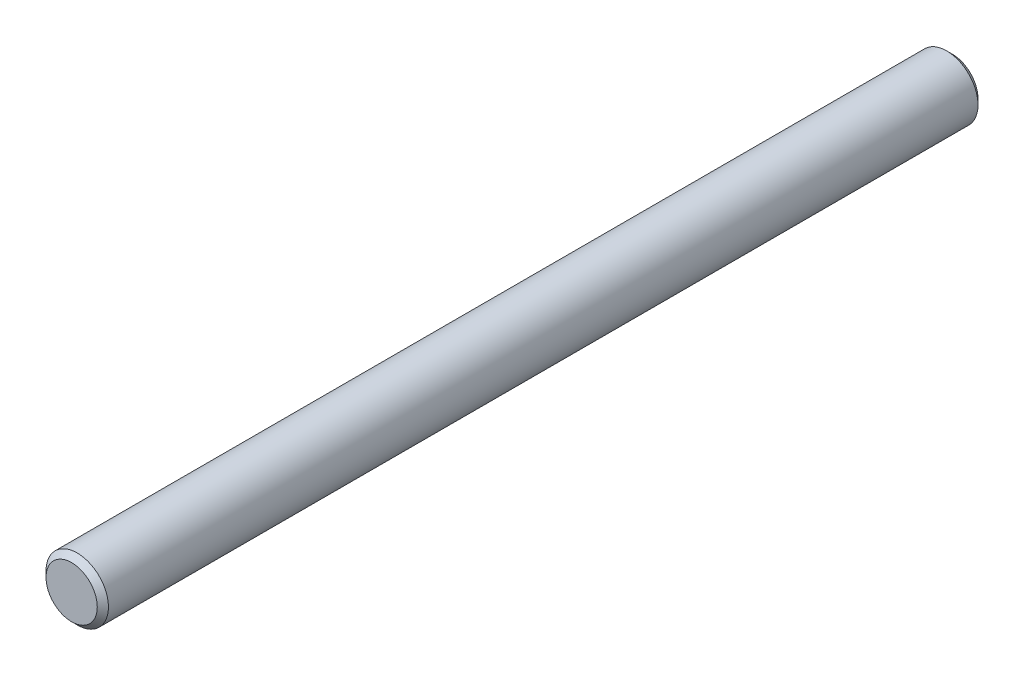
ISO-10303-21;
HEADER;
FILE_DESCRIPTION(('STEP AP214'),'2;1');
FILE_NAME('part.step','',(''),(''),'','','');
FILE_SCHEMA(('AUTOMOTIVE_DESIGN { 1 0 10303 214 1 1 1 1 }'));
ENDSEC;
DATA;
#1=APPLICATION_CONTEXT('core data for automotive mechanical design processes');
#2=APPLICATION_PROTOCOL_DEFINITION('international standard','automotive_design',2000,#1);
#3=PRODUCT_CONTEXT('',#1,'mechanical');
#4=PRODUCT('Part','Part','',(#3));
#5=PRODUCT_RELATED_PRODUCT_CATEGORY('part','',(#4));
#6=PRODUCT_DEFINITION_FORMATION('','',#4);
#7=PRODUCT_DEFINITION_CONTEXT('part definition',#1,'design');
#8=PRODUCT_DEFINITION('design','',#6,#7);
#9=PRODUCT_DEFINITION_SHAPE('','',#8);
#10=(LENGTH_UNIT() NAMED_UNIT(*) SI_UNIT(.MILLI.,.METRE.));
#11=(NAMED_UNIT(*) PLANE_ANGLE_UNIT() SI_UNIT($,.RADIAN.));
#12=(NAMED_UNIT(*) SI_UNIT($,.STERADIAN.) SOLID_ANGLE_UNIT());
#13=UNCERTAINTY_MEASURE_WITH_UNIT(LENGTH_MEASURE(1.E-05),#10,'distance_accuracy_value','');
#14=(GEOMETRIC_REPRESENTATION_CONTEXT(3) GLOBAL_UNCERTAINTY_ASSIGNED_CONTEXT((#13)) GLOBAL_UNIT_ASSIGNED_CONTEXT((#10,
#11,#12)) REPRESENTATION_CONTEXT('',''));
#15=CARTESIAN_POINT('',(0.,0.,0.));
#16=DIRECTION('',(0.,0.,1.));
#17=DIRECTION('',(1.,0.,0.));
#18=AXIS2_PLACEMENT_3D('',#15,#16,#17);
#19=CARTESIAN_POINT('',(0.,0.,-79.));
#20=DIRECTION('',(0.,0.,1.));
#21=DIRECTION('',(1.,0.,0.));
#22=AXIS2_PLACEMENT_3D('',#19,#20,#21);
#23=CYLINDRICAL_SURFACE('',#22,2.8);
#24=CARTESIAN_POINT('',(0.,0.,-78.5));
#25=DIRECTION('',(0.,0.,1.));
#26=DIRECTION('',(1.,0.,0.));
#27=AXIS2_PLACEMENT_3D('',#24,#25,#26);
#28=CIRCLE('',#27,2.8);
#29=CARTESIAN_POINT('',(2.8,0.,-78.5));
#30=VERTEX_POINT('',#29);
#31=EDGE_CURVE('E59',#30,#30,#28,.T.);
#32=ORIENTED_EDGE('',*,*,#31,.T.);
#33=EDGE_LOOP('',(#32));
#34=FACE_BOUND('',#33,.T.);
#35=CARTESIAN_POINT('',(0.,0.,-0.5));
#36=DIRECTION('',(0.,0.,1.));
#37=DIRECTION('',(1.,0.,0.));
#38=AXIS2_PLACEMENT_3D('',#35,#36,#37);
#39=CIRCLE('',#38,2.8);
#40=CARTESIAN_POINT('',(2.8,0.,-0.5));
#41=VERTEX_POINT('',#40);
#42=EDGE_CURVE('E64',#41,#41,#39,.F.);
#43=ORIENTED_EDGE('',*,*,#42,.T.);
#44=EDGE_LOOP('',(#43));
#45=FACE_BOUND('',#44,.T.);
#46=ADVANCED_FACE('F45',(#34,#45),#23,.T.);
#47=CARTESIAN_POINT('',(0.,0.,-79.));
#48=DIRECTION('',(0.,0.,1.));
#49=DIRECTION('',(1.,0.,0.));
#50=AXIS2_PLACEMENT_3D('',#47,#48,#49);
#51=PLANE('',#50);
#52=CARTESIAN_POINT('',(0.,0.,-79.));
#53=DIRECTION('',(0.,0.,1.));
#54=DIRECTION('',(1.,0.,0.));
#55=AXIS2_PLACEMENT_3D('',#52,#53,#54);
#56=CIRCLE('',#55,2.3);
#57=CARTESIAN_POINT('',(2.3,0.,-79.));
#58=VERTEX_POINT('',#57);
#59=EDGE_CURVE('E54',#58,#58,#56,.F.);
#60=ORIENTED_EDGE('',*,*,#59,.T.);
#61=EDGE_LOOP('',(#60));
#62=FACE_BOUND('',#61,.T.);
#63=ADVANCED_FACE('F81',(#62),#51,.F.);
#64=CARTESIAN_POINT('',(0.,0.,0.));
#65=DIRECTION('',(0.,0.,1.));
#66=DIRECTION('',(1.,0.,0.));
#67=AXIS2_PLACEMENT_3D('',#64,#65,#66);
#68=PLANE('',#67);
#69=CARTESIAN_POINT('',(0.,0.,0.));
#70=DIRECTION('',(0.,0.,1.));
#71=DIRECTION('',(1.,0.,0.));
#72=AXIS2_PLACEMENT_3D('',#69,#70,#71);
#73=CIRCLE('',#72,2.3);
#74=CARTESIAN_POINT('',(2.3,0.,0.));
#75=VERTEX_POINT('',#74);
#76=EDGE_CURVE('E10',#75,#75,#73,.T.);
#77=ORIENTED_EDGE('',*,*,#76,.T.);
#78=EDGE_LOOP('',(#77));
#79=FACE_BOUND('',#78,.T.);
#80=ADVANCED_FACE('F78',(#79),#68,.T.);
#81=CARTESIAN_POINT('',(0.,0.,-78.5));
#82=DIRECTION('',(0.,0.,1.));
#83=DIRECTION('',(1.,0.,0.));
#84=AXIS2_PLACEMENT_3D('',#81,#82,#83);
#85=CONICAL_SURFACE('',#84,2.8,0.785398163397444);
#86=ORIENTED_EDGE('',*,*,#59,.F.);
#87=EDGE_LOOP('',(#86));
#88=FACE_BOUND('',#87,.T.);
#89=ORIENTED_EDGE('',*,*,#31,.F.);
#90=EDGE_LOOP('',(#89));
#91=FACE_BOUND('',#90,.T.);
#92=ADVANCED_FACE('F74',(#88,#91),#85,.T.);
#93=CARTESIAN_POINT('',(0.,0.,0.));
#94=DIRECTION('',(0.,0.,-1.));
#95=DIRECTION('',(-1.,0.,0.));
#96=AXIS2_PLACEMENT_3D('',#93,#94,#95);
#97=CONICAL_SURFACE('',#96,2.3,0.785398163397444);
#98=ORIENTED_EDGE('',*,*,#42,.F.);
#99=EDGE_LOOP('',(#98));
#100=FACE_BOUND('',#99,.T.);
#101=ORIENTED_EDGE('',*,*,#76,.F.);
#102=EDGE_LOOP('',(#101));
#103=FACE_BOUND('',#102,.T.);
#104=ADVANCED_FACE('F48',(#100,#103),#97,.T.);
#105=CLOSED_SHELL('',(#46,#63,#80,#92,#104));
#106=MANIFOLD_SOLID_BREP('B2',#105);
#107=ADVANCED_BREP_SHAPE_REPRESENTATION('',(#18,#106),#14);
#108=SHAPE_DEFINITION_REPRESENTATION(#9,#107);
ENDSEC;
END-ISO-10303-21;
